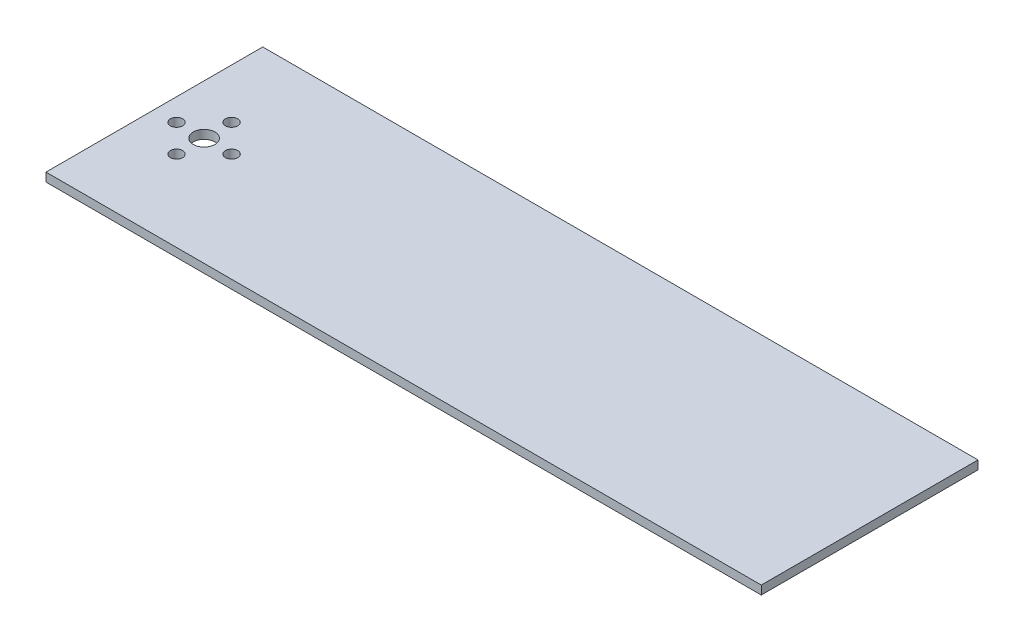
ISO-10303-21;
HEADER;
FILE_DESCRIPTION(('STEP AP214'),'2;1');
FILE_NAME('part.step','',(''),(''),'','','');
FILE_SCHEMA(('AUTOMOTIVE_DESIGN { 1 0 10303 214 1 1 1 1 }'));
ENDSEC;
DATA;
#1=APPLICATION_CONTEXT('core data for automotive mechanical design processes');
#2=APPLICATION_PROTOCOL_DEFINITION('international standard','automotive_design',2000,#1);
#3=PRODUCT_CONTEXT('',#1,'mechanical');
#4=PRODUCT('Part','Part','',(#3));
#5=PRODUCT_RELATED_PRODUCT_CATEGORY('part','',(#4));
#6=PRODUCT_DEFINITION_FORMATION('','',#4);
#7=PRODUCT_DEFINITION_CONTEXT('part definition',#1,'design');
#8=PRODUCT_DEFINITION('design','',#6,#7);
#9=PRODUCT_DEFINITION_SHAPE('','',#8);
#10=(LENGTH_UNIT() NAMED_UNIT(*) SI_UNIT(.MILLI.,.METRE.));
#11=(NAMED_UNIT(*) PLANE_ANGLE_UNIT() SI_UNIT($,.RADIAN.));
#12=(NAMED_UNIT(*) SI_UNIT($,.STERADIAN.) SOLID_ANGLE_UNIT());
#13=UNCERTAINTY_MEASURE_WITH_UNIT(LENGTH_MEASURE(1.E-05),#10,'distance_accuracy_value','');
#14=(GEOMETRIC_REPRESENTATION_CONTEXT(3) GLOBAL_UNCERTAINTY_ASSIGNED_CONTEXT((#13)) GLOBAL_UNIT_ASSIGNED_CONTEXT((#10,
#11,#12)) REPRESENTATION_CONTEXT('',''));
#15=CARTESIAN_POINT('',(0.,0.,0.));
#16=DIRECTION('',(0.,0.,1.));
#17=DIRECTION('',(1.,0.,0.));
#18=AXIS2_PLACEMENT_3D('',#15,#16,#17);
#19=CARTESIAN_POINT('',(82.5,2.,25.));
#20=DIRECTION('',(-1.,0.,0.));
#21=DIRECTION('',(0.,0.,1.));
#22=AXIS2_PLACEMENT_3D('',#19,#20,#21);
#23=PLANE('',#22);
#24=DIRECTION('',(0.,0.,-1.));
#25=VECTOR('',#24,1.);
#26=CARTESIAN_POINT('',(82.5,0.,25.));
#27=LINE('',#26,#25);
#28=CARTESIAN_POINT('',(82.5,0.,25.));
#29=VERTEX_POINT('',#28);
#30=CARTESIAN_POINT('',(82.5,0.,-25.));
#31=VERTEX_POINT('',#30);
#32=EDGE_CURVE('E96',#29,#31,#27,.T.);
#33=ORIENTED_EDGE('',*,*,#32,.T.);
#34=DIRECTION('',(0.,-1.,0.));
#35=VECTOR('',#34,1.);
#36=CARTESIAN_POINT('',(82.5,2.,-25.));
#37=LINE('',#36,#35);
#38=CARTESIAN_POINT('',(82.5,2.,-25.));
#39=VERTEX_POINT('',#38);
#40=EDGE_CURVE('E11',#39,#31,#37,.T.);
#41=ORIENTED_EDGE('',*,*,#40,.F.);
#42=DIRECTION('',(0.,0.,-1.));
#43=VECTOR('',#42,1.);
#44=CARTESIAN_POINT('',(82.5,2.,25.));
#45=LINE('',#44,#43);
#46=CARTESIAN_POINT('',(82.5,2.,25.));
#47=VERTEX_POINT('',#46);
#48=EDGE_CURVE('E84',#47,#39,#45,.T.);
#49=ORIENTED_EDGE('',*,*,#48,.F.);
#50=DIRECTION('',(0.,-1.,0.));
#51=VECTOR('',#50,1.);
#52=CARTESIAN_POINT('',(82.5,2.,25.));
#53=LINE('',#52,#51);
#54=EDGE_CURVE('E92',#47,#29,#53,.T.);
#55=ORIENTED_EDGE('',*,*,#54,.T.);
#56=EDGE_LOOP('',(#33,#41,#49,#55));
#57=FACE_BOUND('',#56,.T.);
#58=ADVANCED_FACE('F33',(#57),#23,.F.);
#59=CARTESIAN_POINT('',(-82.5,2.,-25.));
#60=DIRECTION('',(0.,0.,1.));
#61=DIRECTION('',(1.,0.,0.));
#62=AXIS2_PLACEMENT_3D('',#59,#60,#61);
#63=PLANE('',#62);
#64=DIRECTION('',(-1.,0.,0.));
#65=VECTOR('',#64,1.);
#66=CARTESIAN_POINT('',(-82.5,0.,-25.));
#67=LINE('',#66,#65);
#68=CARTESIAN_POINT('',(-82.5,0.,-25.));
#69=VERTEX_POINT('',#68);
#70=EDGE_CURVE('E88',#31,#69,#67,.T.);
#71=ORIENTED_EDGE('',*,*,#70,.T.);
#72=DIRECTION('',(0.,-1.,0.));
#73=VECTOR('',#72,1.);
#74=CARTESIAN_POINT('',(-82.5,2.,-25.));
#75=LINE('',#74,#73);
#76=CARTESIAN_POINT('',(-82.5,2.,-25.));
#77=VERTEX_POINT('',#76);
#78=EDGE_CURVE('E41',#77,#69,#75,.T.);
#79=ORIENTED_EDGE('',*,*,#78,.F.);
#80=DIRECTION('',(-1.,0.,0.));
#81=VECTOR('',#80,1.);
#82=CARTESIAN_POINT('',(-82.5,2.,-25.));
#83=LINE('',#82,#81);
#84=EDGE_CURVE('E79',#39,#77,#83,.T.);
#85=ORIENTED_EDGE('',*,*,#84,.F.);
#86=ORIENTED_EDGE('',*,*,#40,.T.);
#87=EDGE_LOOP('',(#71,#79,#85,#86));
#88=FACE_BOUND('',#87,.T.);
#89=ADVANCED_FACE('F87',(#88),#63,.F.);
#90=CARTESIAN_POINT('',(-82.5,2.,25.));
#91=DIRECTION('',(1.,0.,0.));
#92=DIRECTION('',(0.,0.,-1.));
#93=AXIS2_PLACEMENT_3D('',#90,#91,#92);
#94=PLANE('',#93);
#95=DIRECTION('',(0.,0.,1.));
#96=VECTOR('',#95,1.);
#97=CARTESIAN_POINT('',(-82.5,0.,25.));
#98=LINE('',#97,#96);
#99=CARTESIAN_POINT('',(-82.5,0.,25.));
#100=VERTEX_POINT('',#99);
#101=EDGE_CURVE('E66',#69,#100,#98,.T.);
#102=ORIENTED_EDGE('',*,*,#101,.T.);
#103=DIRECTION('',(0.,-1.,0.));
#104=VECTOR('',#103,1.);
#105=CARTESIAN_POINT('',(-82.5,2.,25.));
#106=LINE('',#105,#104);
#107=CARTESIAN_POINT('',(-82.5,2.,25.));
#108=VERTEX_POINT('',#107);
#109=EDGE_CURVE('E89',#108,#100,#106,.T.);
#110=ORIENTED_EDGE('',*,*,#109,.F.);
#111=DIRECTION('',(0.,0.,1.));
#112=VECTOR('',#111,1.);
#113=CARTESIAN_POINT('',(-82.5,2.,25.));
#114=LINE('',#113,#112);
#115=EDGE_CURVE('E82',#77,#108,#114,.T.);
#116=ORIENTED_EDGE('',*,*,#115,.F.);
#117=ORIENTED_EDGE('',*,*,#78,.T.);
#118=EDGE_LOOP('',(#102,#110,#116,#117));
#119=FACE_BOUND('',#118,.T.);
#120=ADVANCED_FACE('F90',(#119),#94,.F.);
#121=CARTESIAN_POINT('',(-82.5,2.,25.));
#122=DIRECTION('',(0.,0.,-1.));
#123=DIRECTION('',(-1.,0.,0.));
#124=AXIS2_PLACEMENT_3D('',#121,#122,#123);
#125=PLANE('',#124);
#126=DIRECTION('',(1.,0.,0.));
#127=VECTOR('',#126,1.);
#128=CARTESIAN_POINT('',(-82.5,0.,25.));
#129=LINE('',#128,#127);
#130=EDGE_CURVE('E72',#100,#29,#129,.T.);
#131=ORIENTED_EDGE('',*,*,#130,.T.);
#132=ORIENTED_EDGE('',*,*,#54,.F.);
#133=DIRECTION('',(1.,0.,0.));
#134=VECTOR('',#133,1.);
#135=CARTESIAN_POINT('',(-82.5,2.,25.));
#136=LINE('',#135,#134);
#137=EDGE_CURVE('E49',#108,#47,#136,.T.);
#138=ORIENTED_EDGE('',*,*,#137,.F.);
#139=ORIENTED_EDGE('',*,*,#109,.T.);
#140=EDGE_LOOP('',(#131,#132,#138,#139));
#141=FACE_BOUND('',#140,.T.);
#142=ADVANCED_FACE('F104',(#141),#125,.F.);
#143=CARTESIAN_POINT('',(0.,2.,0.));
#144=DIRECTION('',(0.,-1.,0.));
#145=DIRECTION('',(0.,0.,-1.));
#146=AXIS2_PLACEMENT_3D('',#143,#144,#145);
#147=PLANE('',#146);
#148=CARTESIAN_POINT('',(-64.6874351813714,2.,-1.52655665885959E-13));
#149=DIRECTION('',(0.,1.,0.));
#150=DIRECTION('',(0.,0.,1.));
#151=AXIS2_PLACEMENT_3D('',#148,#149,#150);
#152=CIRCLE('',#151,1.42000000000001);
#153=CARTESIAN_POINT('',(-64.6874351813714,2.,1.41999999999986));
#154=VERTEX_POINT('',#153);
#155=EDGE_CURVE('E128',#154,#154,#152,.T.);
#156=ORIENTED_EDGE('',*,*,#155,.F.);
#157=EDGE_LOOP('',(#156));
#158=FACE_BOUND('',#157,.T.);
#159=CARTESIAN_POINT('',(-71.0374351813713,2.,6.35));
#160=DIRECTION('',(0.,1.,0.));
#161=DIRECTION('',(0.,0.,1.));
#162=AXIS2_PLACEMENT_3D('',#159,#160,#161);
#163=CIRCLE('',#162,1.42000000000001);
#164=CARTESIAN_POINT('',(-71.0374351813713,2.,7.77000000000001));
#165=VERTEX_POINT('',#164);
#166=EDGE_CURVE('E134',#165,#165,#163,.T.);
#167=ORIENTED_EDGE('',*,*,#166,.F.);
#168=EDGE_LOOP('',(#167));
#169=FACE_BOUND('',#168,.T.);
#170=CARTESIAN_POINT('',(-77.3874351813714,2.,1.11022302462516E-13));
#171=DIRECTION('',(0.,1.,0.));
#172=DIRECTION('',(0.,0.,1.));
#173=AXIS2_PLACEMENT_3D('',#170,#171,#172);
#174=CIRCLE('',#173,1.42000000000001);
#175=CARTESIAN_POINT('',(-77.3874351813714,2.,1.42000000000012));
#176=VERTEX_POINT('',#175);
#177=EDGE_CURVE('E116',#176,#176,#174,.T.);
#178=ORIENTED_EDGE('',*,*,#177,.F.);
#179=EDGE_LOOP('',(#178));
#180=FACE_BOUND('',#179,.T.);
#181=CARTESIAN_POINT('',(-71.0374351813714,2.,-6.35));
#182=DIRECTION('',(0.,1.,0.));
#183=DIRECTION('',(0.,0.,1.));
#184=AXIS2_PLACEMENT_3D('',#181,#182,#183);
#185=CIRCLE('',#184,1.42000000000001);
#186=CARTESIAN_POINT('',(-71.0374351813714,2.,-4.92999999999999));
#187=VERTEX_POINT('',#186);
#188=EDGE_CURVE('E123',#187,#187,#185,.T.);
#189=ORIENTED_EDGE('',*,*,#188,.F.);
#190=EDGE_LOOP('',(#189));
#191=FACE_BOUND('',#190,.T.);
#192=CARTESIAN_POINT('',(-71.0374351813714,2.,0.));
#193=DIRECTION('',(0.,1.,0.));
#194=DIRECTION('',(0.,0.,1.));
#195=AXIS2_PLACEMENT_3D('',#192,#193,#194);
#196=CIRCLE('',#195,2.5);
#197=CARTESIAN_POINT('',(-71.0374351813714,2.,2.5));
#198=VERTEX_POINT('',#197);
#199=EDGE_CURVE('E110',#198,#198,#196,.T.);
#200=ORIENTED_EDGE('',*,*,#199,.F.);
#201=EDGE_LOOP('',(#200));
#202=FACE_BOUND('',#201,.T.);
#203=ORIENTED_EDGE('',*,*,#48,.T.);
#204=ORIENTED_EDGE('',*,*,#84,.T.);
#205=ORIENTED_EDGE('',*,*,#115,.T.);
#206=ORIENTED_EDGE('',*,*,#137,.T.);
#207=EDGE_LOOP('',(#203,#204,#205,#206));
#208=FACE_BOUND('',#207,.T.);
#209=ADVANCED_FACE('F80',(#158,#169,#180,#191,#202,#208),#147,.F.);
#210=CARTESIAN_POINT('',(0.,0.,0.));
#211=DIRECTION('',(0.,-1.,0.));
#212=DIRECTION('',(0.,0.,-1.));
#213=AXIS2_PLACEMENT_3D('',#210,#211,#212);
#214=PLANE('',#213);
#215=CARTESIAN_POINT('',(-64.6874351813714,0.,-1.52655665885959E-13));
#216=DIRECTION('',(0.,1.,0.));
#217=DIRECTION('',(0.,0.,1.));
#218=AXIS2_PLACEMENT_3D('',#215,#216,#217);
#219=CIRCLE('',#218,1.42000000000001);
#220=CARTESIAN_POINT('',(-64.6874351813714,0.,1.41999999999986));
#221=VERTEX_POINT('',#220);
#222=EDGE_CURVE('E131',#221,#221,#219,.T.);
#223=ORIENTED_EDGE('',*,*,#222,.T.);
#224=EDGE_LOOP('',(#223));
#225=FACE_BOUND('',#224,.T.);
#226=CARTESIAN_POINT('',(-71.0374351813713,0.,6.35));
#227=DIRECTION('',(0.,1.,0.));
#228=DIRECTION('',(0.,0.,1.));
#229=AXIS2_PLACEMENT_3D('',#226,#227,#228);
#230=CIRCLE('',#229,1.42000000000001);
#231=CARTESIAN_POINT('',(-71.0374351813713,0.,7.77000000000001));
#232=VERTEX_POINT('',#231);
#233=EDGE_CURVE('E120',#232,#232,#230,.T.);
#234=ORIENTED_EDGE('',*,*,#233,.T.);
#235=EDGE_LOOP('',(#234));
#236=FACE_BOUND('',#235,.T.);
#237=CARTESIAN_POINT('',(-77.3874351813714,0.,1.11022302462516E-13));
#238=DIRECTION('',(0.,1.,0.));
#239=DIRECTION('',(0.,0.,1.));
#240=AXIS2_PLACEMENT_3D('',#237,#238,#239);
#241=CIRCLE('',#240,1.42000000000001);
#242=CARTESIAN_POINT('',(-77.3874351813714,0.,1.42000000000012));
#243=VERTEX_POINT('',#242);
#244=EDGE_CURVE('E119',#243,#243,#241,.T.);
#245=ORIENTED_EDGE('',*,*,#244,.T.);
#246=EDGE_LOOP('',(#245));
#247=FACE_BOUND('',#246,.T.);
#248=CARTESIAN_POINT('',(-71.0374351813714,0.,-6.35));
#249=DIRECTION('',(0.,1.,0.));
#250=DIRECTION('',(0.,0.,1.));
#251=AXIS2_PLACEMENT_3D('',#248,#249,#250);
#252=CIRCLE('',#251,1.42000000000001);
#253=CARTESIAN_POINT('',(-71.0374351813714,0.,-4.92999999999999));
#254=VERTEX_POINT('',#253);
#255=EDGE_CURVE('E113',#254,#254,#252,.T.);
#256=ORIENTED_EDGE('',*,*,#255,.T.);
#257=EDGE_LOOP('',(#256));
#258=FACE_BOUND('',#257,.T.);
#259=CARTESIAN_POINT('',(-71.0374351813714,0.,0.));
#260=DIRECTION('',(0.,1.,0.));
#261=DIRECTION('',(0.,0.,1.));
#262=AXIS2_PLACEMENT_3D('',#259,#260,#261);
#263=CIRCLE('',#262,2.5);
#264=CARTESIAN_POINT('',(-71.0374351813714,0.,2.5));
#265=VERTEX_POINT('',#264);
#266=EDGE_CURVE('E99',#265,#265,#263,.T.);
#267=ORIENTED_EDGE('',*,*,#266,.T.);
#268=EDGE_LOOP('',(#267));
#269=FACE_BOUND('',#268,.T.);
#270=ORIENTED_EDGE('',*,*,#32,.F.);
#271=ORIENTED_EDGE('',*,*,#130,.F.);
#272=ORIENTED_EDGE('',*,*,#101,.F.);
#273=ORIENTED_EDGE('',*,*,#70,.F.);
#274=EDGE_LOOP('',(#270,#271,#272,#273));
#275=FACE_BOUND('',#274,.T.);
#276=ADVANCED_FACE('F107',(#225,#236,#247,#258,#269,#275),#214,.T.);
#277=CARTESIAN_POINT('',(-71.0374351813714,0.,0.));
#278=DIRECTION('',(0.,1.,0.));
#279=DIRECTION('',(0.,0.,1.));
#280=AXIS2_PLACEMENT_3D('',#277,#278,#279);
#281=CYLINDRICAL_SURFACE('',#280,2.5);
#282=ORIENTED_EDGE('',*,*,#266,.F.);
#283=EDGE_LOOP('',(#282));
#284=FACE_BOUND('',#283,.T.);
#285=ORIENTED_EDGE('',*,*,#199,.T.);
#286=EDGE_LOOP('',(#285));
#287=FACE_BOUND('',#286,.T.);
#288=ADVANCED_FACE('F160',(#284,#287),#281,.F.);
#289=CARTESIAN_POINT('',(-71.0374351813714,0.,-6.35));
#290=DIRECTION('',(0.,1.,0.));
#291=DIRECTION('',(0.,0.,1.));
#292=AXIS2_PLACEMENT_3D('',#289,#290,#291);
#293=CYLINDRICAL_SURFACE('',#292,1.42000000000001);
#294=ORIENTED_EDGE('',*,*,#255,.F.);
#295=EDGE_LOOP('',(#294));
#296=FACE_BOUND('',#295,.T.);
#297=ORIENTED_EDGE('',*,*,#188,.T.);
#298=EDGE_LOOP('',(#297));
#299=FACE_BOUND('',#298,.T.);
#300=ADVANCED_FACE('F162',(#296,#299),#293,.F.);
#301=CARTESIAN_POINT('',(-77.3874351813714,0.,1.11022302462516E-13));
#302=DIRECTION('',(0.,1.,0.));
#303=DIRECTION('',(0.,0.,1.));
#304=AXIS2_PLACEMENT_3D('',#301,#302,#303);
#305=CYLINDRICAL_SURFACE('',#304,1.42000000000001);
#306=ORIENTED_EDGE('',*,*,#244,.F.);
#307=EDGE_LOOP('',(#306));
#308=FACE_BOUND('',#307,.T.);
#309=ORIENTED_EDGE('',*,*,#177,.T.);
#310=EDGE_LOOP('',(#309));
#311=FACE_BOUND('',#310,.T.);
#312=ADVANCED_FACE('F146',(#308,#311),#305,.F.);
#313=CARTESIAN_POINT('',(-71.0374351813713,0.,6.35));
#314=DIRECTION('',(0.,1.,0.));
#315=DIRECTION('',(0.,0.,1.));
#316=AXIS2_PLACEMENT_3D('',#313,#314,#315);
#317=CYLINDRICAL_SURFACE('',#316,1.42000000000001);
#318=ORIENTED_EDGE('',*,*,#233,.F.);
#319=EDGE_LOOP('',(#318));
#320=FACE_BOUND('',#319,.T.);
#321=ORIENTED_EDGE('',*,*,#166,.T.);
#322=EDGE_LOOP('',(#321));
#323=FACE_BOUND('',#322,.T.);
#324=ADVANCED_FACE('F142',(#320,#323),#317,.F.);
#325=CARTESIAN_POINT('',(-64.6874351813714,0.,-1.52655665885959E-13));
#326=DIRECTION('',(0.,1.,0.));
#327=DIRECTION('',(0.,0.,1.));
#328=AXIS2_PLACEMENT_3D('',#325,#326,#327);
#329=CYLINDRICAL_SURFACE('',#328,1.42000000000001);
#330=ORIENTED_EDGE('',*,*,#222,.F.);
#331=EDGE_LOOP('',(#330));
#332=FACE_BOUND('',#331,.T.);
#333=ORIENTED_EDGE('',*,*,#155,.T.);
#334=EDGE_LOOP('',(#333));
#335=FACE_BOUND('',#334,.T.);
#336=ADVANCED_FACE('F145',(#332,#335),#329,.F.);
#337=CLOSED_SHELL('',(#58,#89,#120,#142,#209,#276,#288,#300,#312,#324,#336));
#338=MANIFOLD_SOLID_BREP('B2',#337);
#339=ADVANCED_BREP_SHAPE_REPRESENTATION('',(#18,#338),#14);
#340=SHAPE_DEFINITION_REPRESENTATION(#9,#339);
ENDSEC;
END-ISO-10303-21;
